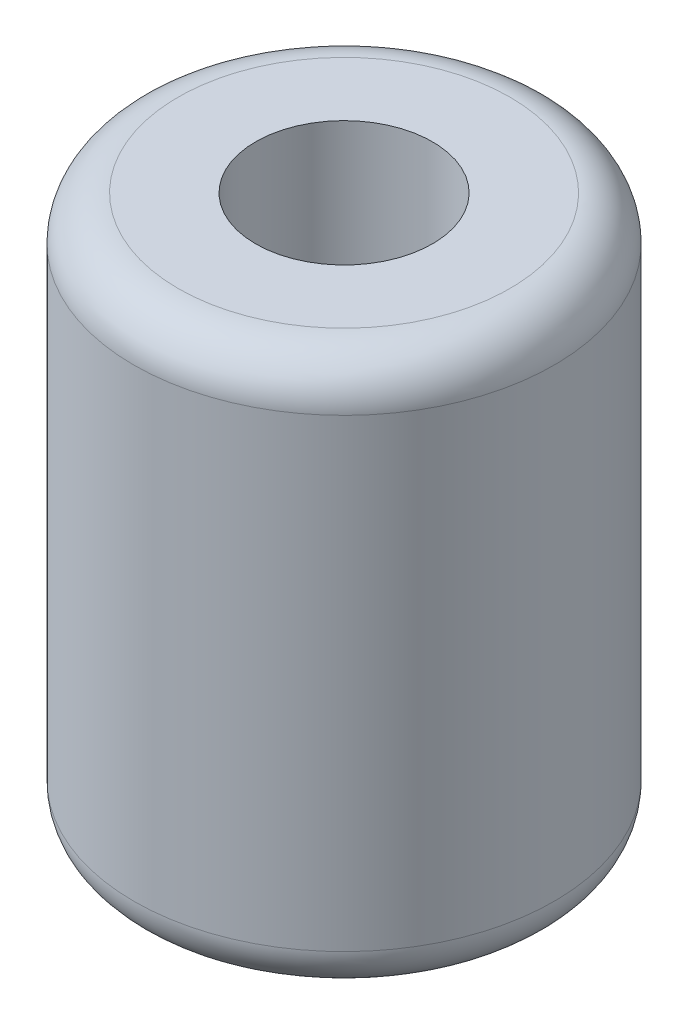
ISO-10303-21;
HEADER;
FILE_DESCRIPTION(('STEP AP214'),'2;1');
FILE_NAME('part.step','',(''),(''),'','','');
FILE_SCHEMA(('AUTOMOTIVE_DESIGN { 1 0 10303 214 1 1 1 1 }'));
ENDSEC;
DATA;
#1=APPLICATION_CONTEXT('core data for automotive mechanical design processes');
#2=APPLICATION_PROTOCOL_DEFINITION('international standard','automotive_design',2000,#1);
#3=PRODUCT_CONTEXT('',#1,'mechanical');
#4=PRODUCT('Part','Part','',(#3));
#5=PRODUCT_RELATED_PRODUCT_CATEGORY('part','',(#4));
#6=PRODUCT_DEFINITION_FORMATION('','',#4);
#7=PRODUCT_DEFINITION_CONTEXT('part definition',#1,'design');
#8=PRODUCT_DEFINITION('design','',#6,#7);
#9=PRODUCT_DEFINITION_SHAPE('','',#8);
#10=(LENGTH_UNIT() NAMED_UNIT(*) SI_UNIT(.MILLI.,.METRE.));
#11=(NAMED_UNIT(*) PLANE_ANGLE_UNIT() SI_UNIT($,.RADIAN.));
#12=(NAMED_UNIT(*) SI_UNIT($,.STERADIAN.) SOLID_ANGLE_UNIT());
#13=UNCERTAINTY_MEASURE_WITH_UNIT(LENGTH_MEASURE(1.E-05),#10,'distance_accuracy_value','');
#14=(GEOMETRIC_REPRESENTATION_CONTEXT(3) GLOBAL_UNCERTAINTY_ASSIGNED_CONTEXT((#13)) GLOBAL_UNIT_ASSIGNED_CONTEXT((#10,
#11,#12)) REPRESENTATION_CONTEXT('',''));
#15=CARTESIAN_POINT('',(0.,0.,0.));
#16=DIRECTION('',(0.,0.,1.));
#17=DIRECTION('',(1.,0.,0.));
#18=AXIS2_PLACEMENT_3D('',#15,#16,#17);
#19=CARTESIAN_POINT('',(0.,25.,0.));
#20=DIRECTION('',(0.,-1.,0.));
#21=DIRECTION('',(0.,0.,-1.));
#22=AXIS2_PLACEMENT_3D('',#19,#20,#21);
#23=CYLINDRICAL_SURFACE('',#22,9.5);
#24=CARTESIAN_POINT('',(0.,2.,0.));
#25=DIRECTION('',(0.,1.,0.));
#26=DIRECTION('',(0.,0.,1.));
#27=AXIS2_PLACEMENT_3D('',#24,#25,#26);
#28=CIRCLE('',#27,9.5);
#29=CARTESIAN_POINT('',(0.,2.,9.5));
#30=VERTEX_POINT('',#29);
#31=EDGE_CURVE('E48',#30,#30,#28,.T.);
#32=ORIENTED_EDGE('',*,*,#31,.T.);
#33=EDGE_LOOP('',(#32));
#34=FACE_BOUND('',#33,.T.);
#35=CARTESIAN_POINT('',(0.,23.,0.));
#36=DIRECTION('',(0.,1.,0.));
#37=DIRECTION('',(0.,0.,1.));
#38=AXIS2_PLACEMENT_3D('',#35,#36,#37);
#39=CIRCLE('',#38,9.5);
#40=CARTESIAN_POINT('',(0.,23.,9.5));
#41=VERTEX_POINT('',#40);
#42=EDGE_CURVE('E52',#41,#41,#39,.F.);
#43=ORIENTED_EDGE('',*,*,#42,.T.);
#44=EDGE_LOOP('',(#43));
#45=FACE_BOUND('',#44,.T.);
#46=ADVANCED_FACE('F37',(#34,#45),#23,.T.);
#47=CARTESIAN_POINT('',(0.,25.,0.));
#48=DIRECTION('',(0.,1.,0.));
#49=DIRECTION('',(0.,0.,1.));
#50=AXIS2_PLACEMENT_3D('',#47,#48,#49);
#51=PLANE('',#50);
#52=CARTESIAN_POINT('',(0.,25.,0.));
#53=DIRECTION('',(0.,1.,0.));
#54=DIRECTION('',(0.,0.,1.));
#55=AXIS2_PLACEMENT_3D('',#52,#53,#54);
#56=CIRCLE('',#55,4.00000000000001);
#57=CARTESIAN_POINT('',(0.,25.,4.00000000000001));
#58=VERTEX_POINT('',#57);
#59=EDGE_CURVE('E60',#58,#58,#56,.T.);
#60=ORIENTED_EDGE('',*,*,#59,.F.);
#61=EDGE_LOOP('',(#60));
#62=FACE_BOUND('',#61,.T.);
#63=CARTESIAN_POINT('',(0.,25.,0.));
#64=DIRECTION('',(0.,1.,0.));
#65=DIRECTION('',(0.,0.,1.));
#66=AXIS2_PLACEMENT_3D('',#63,#64,#65);
#67=CIRCLE('',#66,7.5);
#68=CARTESIAN_POINT('',(0.,25.,7.5));
#69=VERTEX_POINT('',#68);
#70=EDGE_CURVE('E10',#69,#69,#67,.T.);
#71=ORIENTED_EDGE('',*,*,#70,.T.);
#72=EDGE_LOOP('',(#71));
#73=FACE_BOUND('',#72,.T.);
#74=ADVANCED_FACE('F75',(#62,#73),#51,.T.);
#75=CARTESIAN_POINT('',(0.,0.,0.));
#76=DIRECTION('',(0.,1.,0.));
#77=DIRECTION('',(0.,0.,1.));
#78=AXIS2_PLACEMENT_3D('',#75,#76,#77);
#79=PLANE('',#78);
#80=CARTESIAN_POINT('',(0.,0.,0.));
#81=DIRECTION('',(0.,-1.,0.));
#82=DIRECTION('',(0.,0.,-1.));
#83=AXIS2_PLACEMENT_3D('',#80,#81,#82);
#84=CIRCLE('',#83,2.50000000000001);
#85=CARTESIAN_POINT('',(0.,0.,-2.50000000000001));
#86=VERTEX_POINT('',#85);
#87=EDGE_CURVE('E66',#86,#86,#84,.T.);
#88=ORIENTED_EDGE('',*,*,#87,.F.);
#89=EDGE_LOOP('',(#88));
#90=FACE_BOUND('',#89,.T.);
#91=CARTESIAN_POINT('',(0.,0.,0.));
#92=DIRECTION('',(0.,1.,0.));
#93=DIRECTION('',(0.,0.,1.));
#94=AXIS2_PLACEMENT_3D('',#91,#92,#93);
#95=CIRCLE('',#94,7.5);
#96=CARTESIAN_POINT('',(0.,0.,7.5));
#97=VERTEX_POINT('',#96);
#98=EDGE_CURVE('E44',#97,#97,#95,.F.);
#99=ORIENTED_EDGE('',*,*,#98,.T.);
#100=EDGE_LOOP('',(#99));
#101=FACE_BOUND('',#100,.T.);
#102=ADVANCED_FACE('F72',(#90,#101),#79,.F.);
#103=CARTESIAN_POINT('',(0.,2.,0.));
#104=DIRECTION('',(0.,1.,0.));
#105=DIRECTION('',(0.,0.,1.));
#106=AXIS2_PLACEMENT_3D('',#103,#104,#105);
#107=TOROIDAL_SURFACE('',#106,7.5,2.);
#108=ORIENTED_EDGE('',*,*,#98,.F.);
#109=EDGE_LOOP('',(#108));
#110=FACE_BOUND('',#109,.T.);
#111=ORIENTED_EDGE('',*,*,#31,.F.);
#112=EDGE_LOOP('',(#111));
#113=FACE_BOUND('',#112,.T.);
#114=ADVANCED_FACE('F74',(#110,#113),#107,.T.);
#115=CARTESIAN_POINT('',(0.,23.,0.));
#116=DIRECTION('',(0.,1.,0.));
#117=DIRECTION('',(0.,0.,1.));
#118=AXIS2_PLACEMENT_3D('',#115,#116,#117);
#119=TOROIDAL_SURFACE('',#118,7.5,2.);
#120=ORIENTED_EDGE('',*,*,#42,.F.);
#121=EDGE_LOOP('',(#120));
#122=FACE_BOUND('',#121,.T.);
#123=ORIENTED_EDGE('',*,*,#70,.F.);
#124=EDGE_LOOP('',(#123));
#125=FACE_BOUND('',#124,.T.);
#126=ADVANCED_FACE('F39',(#122,#125),#119,.T.);
#127=CARTESIAN_POINT('',(0.,12.5,0.));
#128=DIRECTION('',(0.,-1.,0.));
#129=DIRECTION('',(0.,0.,-1.));
#130=AXIS2_PLACEMENT_3D('',#127,#128,#129);
#131=PLANE('',#130);
#132=CARTESIAN_POINT('',(0.,12.5,0.));
#133=DIRECTION('',(0.,-1.,0.));
#134=DIRECTION('',(0.,0.,-1.));
#135=AXIS2_PLACEMENT_3D('',#132,#133,#134);
#136=CIRCLE('',#135,2.50000000000001);
#137=CARTESIAN_POINT('',(0.,12.5,-2.50000000000001));
#138=VERTEX_POINT('',#137);
#139=EDGE_CURVE('E63',#138,#138,#136,.T.);
#140=ORIENTED_EDGE('',*,*,#139,.T.);
#141=EDGE_LOOP('',(#140));
#142=FACE_BOUND('',#141,.T.);
#143=CARTESIAN_POINT('',(0.,12.5,0.));
#144=DIRECTION('',(0.,1.,0.));
#145=DIRECTION('',(0.,0.,1.));
#146=AXIS2_PLACEMENT_3D('',#143,#144,#145);
#147=CIRCLE('',#146,4.00000000000001);
#148=CARTESIAN_POINT('',(0.,12.5,4.00000000000001));
#149=VERTEX_POINT('',#148);
#150=EDGE_CURVE('E57',#149,#149,#147,.T.);
#151=ORIENTED_EDGE('',*,*,#150,.T.);
#152=EDGE_LOOP('',(#151));
#153=FACE_BOUND('',#152,.T.);
#154=ADVANCED_FACE('F97',(#142,#153),#131,.F.);
#155=CARTESIAN_POINT('',(0.,25.,0.));
#156=DIRECTION('',(0.,1.,0.));
#157=DIRECTION('',(0.,0.,1.));
#158=AXIS2_PLACEMENT_3D('',#155,#156,#157);
#159=CYLINDRICAL_SURFACE('',#158,4.00000000000001);
#160=ORIENTED_EDGE('',*,*,#150,.F.);
#161=EDGE_LOOP('',(#160));
#162=FACE_BOUND('',#161,.T.);
#163=ORIENTED_EDGE('',*,*,#59,.T.);
#164=EDGE_LOOP('',(#163));
#165=FACE_BOUND('',#164,.T.);
#166=ADVANCED_FACE('F100',(#162,#165),#159,.F.);
#167=CARTESIAN_POINT('',(0.,0.,0.));
#168=DIRECTION('',(0.,-1.,0.));
#169=DIRECTION('',(0.,0.,-1.));
#170=AXIS2_PLACEMENT_3D('',#167,#168,#169);
#171=CYLINDRICAL_SURFACE('',#170,2.50000000000001);
#172=ORIENTED_EDGE('',*,*,#139,.F.);
#173=EDGE_LOOP('',(#172));
#174=FACE_BOUND('',#173,.T.);
#175=ORIENTED_EDGE('',*,*,#87,.T.);
#176=EDGE_LOOP('',(#175));
#177=FACE_BOUND('',#176,.T.);
#178=ADVANCED_FACE('F70',(#174,#177),#171,.F.);
#179=CLOSED_SHELL('',(#46,#74,#102,#114,#126,#154,#166,#178));
#180=MANIFOLD_SOLID_BREP('B2',#179);
#181=ADVANCED_BREP_SHAPE_REPRESENTATION('',(#18,#180),#14);
#182=SHAPE_DEFINITION_REPRESENTATION(#9,#181);
ENDSEC;
END-ISO-10303-21;
